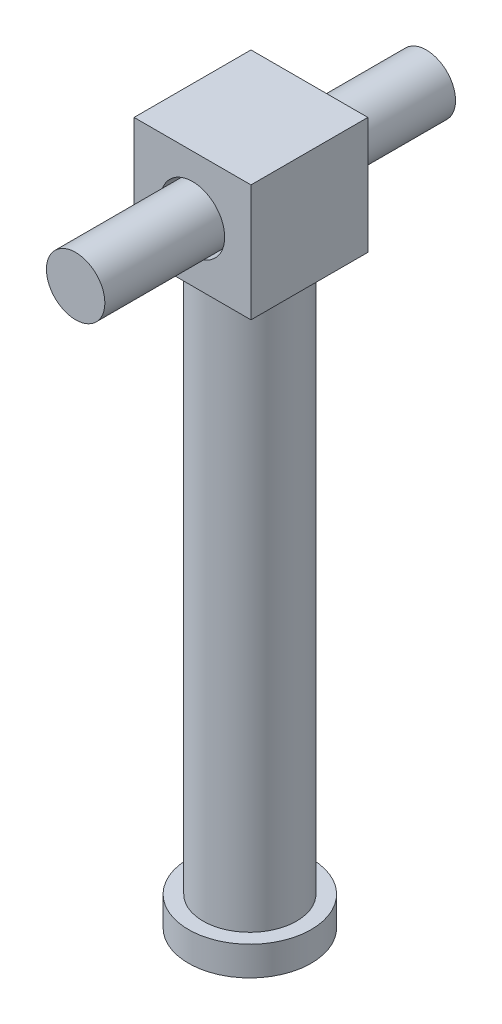
ISO-10303-21;
HEADER;
FILE_DESCRIPTION(('STEP AP214'),'2;1');
FILE_NAME('part.step','',(''),(''),'','','');
FILE_SCHEMA(('AUTOMOTIVE_DESIGN { 1 0 10303 214 1 1 1 1 }'));
ENDSEC;
DATA;
#1=APPLICATION_CONTEXT('core data for automotive mechanical design processes');
#2=APPLICATION_PROTOCOL_DEFINITION('international standard','automotive_design',2000,#1);
#3=PRODUCT_CONTEXT('',#1,'mechanical');
#4=PRODUCT('Part','Part','',(#3));
#5=PRODUCT_RELATED_PRODUCT_CATEGORY('part','',(#4));
#6=PRODUCT_DEFINITION_FORMATION('','',#4);
#7=PRODUCT_DEFINITION_CONTEXT('part definition',#1,'design');
#8=PRODUCT_DEFINITION('design','',#6,#7);
#9=PRODUCT_DEFINITION_SHAPE('','',#8);
#10=(LENGTH_UNIT() NAMED_UNIT(*) SI_UNIT(.MILLI.,.METRE.));
#11=(NAMED_UNIT(*) PLANE_ANGLE_UNIT() SI_UNIT($,.RADIAN.));
#12=(NAMED_UNIT(*) SI_UNIT($,.STERADIAN.) SOLID_ANGLE_UNIT());
#13=UNCERTAINTY_MEASURE_WITH_UNIT(LENGTH_MEASURE(1.E-05),#10,'distance_accuracy_value','');
#14=(GEOMETRIC_REPRESENTATION_CONTEXT(3) GLOBAL_UNCERTAINTY_ASSIGNED_CONTEXT((#13)) GLOBAL_UNIT_ASSIGNED_CONTEXT((#10,
#11,#12)) REPRESENTATION_CONTEXT('',''));
#15=CARTESIAN_POINT('',(0.,0.,0.));
#16=DIRECTION('',(0.,0.,1.));
#17=DIRECTION('',(1.,0.,0.));
#18=AXIS2_PLACEMENT_3D('',#15,#16,#17);
#19=CARTESIAN_POINT('',(0.,100.,0.388679949213961));
#20=DIRECTION('',(0.,-1.,0.));
#21=DIRECTION('',(0.,0.,-1.));
#22=AXIS2_PLACEMENT_3D('',#19,#20,#21);
#23=CYLINDRICAL_SURFACE('',#22,16.);
#24=CARTESIAN_POINT('',(0.,100.,0.388679949213961));
#25=DIRECTION('',(0.,1.,0.));
#26=DIRECTION('',(0.,0.,1.));
#27=AXIS2_PLACEMENT_3D('',#24,#25,#26);
#28=CIRCLE('',#27,16.);
#29=CARTESIAN_POINT('',(0.,100.,-15.611320050786));
#30=VERTEX_POINT('',#29);
#31=EDGE_CURVE('E116',#30,#30,#28,.T.);
#32=CARTESIAN_POINT('',(0.,-90.,0.388679949213961));
#33=DIRECTION('',(0.,-1.,0.));
#34=DIRECTION('',(0.,0.,-1.));
#35=AXIS2_PLACEMENT_3D('',#32,#33,#34);
#36=CIRCLE('',#35,16.);
#37=CARTESIAN_POINT('',(0.,-90.,-15.611320050786));
#38=VERTEX_POINT('',#37);
#39=EDGE_CURVE('E52',#38,#38,#36,.T.);
#40=CARTESIAN_POINT('',(0.,100.,-15.611320050786));
#41=CARTESIAN_POINT('',(0.,98.0208333333333,-15.611320050786));
#42=CARTESIAN_POINT('',(0.,96.0416666666667,-15.611320050786));
#43=CARTESIAN_POINT('',(0.,92.0833333333333,-15.611320050786));
#44=CARTESIAN_POINT('',(0.,90.1041666666667,-15.611320050786));
#45=CARTESIAN_POINT('',(0.,86.1458333333333,-15.611320050786));
#46=CARTESIAN_POINT('',(0.,84.1666666666667,-15.611320050786));
#47=CARTESIAN_POINT('',(0.,80.2083333333333,-15.611320050786));
#48=CARTESIAN_POINT('',(0.,78.2291666666667,-15.611320050786));
#49=CARTESIAN_POINT('',(0.,74.2708333333333,-15.611320050786));
#50=CARTESIAN_POINT('',(0.,72.2916666666667,-15.611320050786));
#51=CARTESIAN_POINT('',(0.,68.3333333333333,-15.611320050786));
#52=CARTESIAN_POINT('',(0.,66.3541666666667,-15.611320050786));
#53=CARTESIAN_POINT('',(0.,62.3958333333333,-15.611320050786));
#54=CARTESIAN_POINT('',(0.,60.4166666666667,-15.611320050786));
#55=CARTESIAN_POINT('',(0.,56.4583333333333,-15.611320050786));
#56=CARTESIAN_POINT('',(0.,54.4791666666667,-15.611320050786));
#57=CARTESIAN_POINT('',(0.,50.5208333333333,-15.611320050786));
#58=CARTESIAN_POINT('',(0.,48.5416666666667,-15.611320050786));
#59=CARTESIAN_POINT('',(0.,44.5833333333333,-15.611320050786));
#60=CARTESIAN_POINT('',(0.,42.6041666666667,-15.611320050786));
#61=CARTESIAN_POINT('',(0.,38.6458333333333,-15.611320050786));
#62=CARTESIAN_POINT('',(0.,36.6666666666667,-15.611320050786));
#63=CARTESIAN_POINT('',(0.,32.7083333333333,-15.611320050786));
#64=CARTESIAN_POINT('',(0.,30.7291666666667,-15.611320050786));
#65=CARTESIAN_POINT('',(0.,26.7708333333333,-15.611320050786));
#66=CARTESIAN_POINT('',(0.,24.7916666666667,-15.611320050786));
#67=CARTESIAN_POINT('',(0.,20.8333333333333,-15.611320050786));
#68=CARTESIAN_POINT('',(0.,18.8541666666667,-15.611320050786));
#69=CARTESIAN_POINT('',(0.,14.8958333333333,-15.611320050786));
#70=CARTESIAN_POINT('',(0.,12.9166666666667,-15.611320050786));
#71=CARTESIAN_POINT('',(0.,8.95833333333332,-15.611320050786));
#72=CARTESIAN_POINT('',(0.,6.97916666666666,-15.611320050786));
#73=CARTESIAN_POINT('',(0.,3.02083333333332,-15.611320050786));
#74=CARTESIAN_POINT('',(0.,1.04166666666666,-15.611320050786));
#75=CARTESIAN_POINT('',(0.,-2.91666666666667,-15.611320050786));
#76=CARTESIAN_POINT('',(0.,-4.89583333333334,-15.611320050786));
#77=CARTESIAN_POINT('',(0.,-8.85416666666667,-15.611320050786));
#78=CARTESIAN_POINT('',(0.,-10.8333333333333,-15.611320050786));
#79=CARTESIAN_POINT('',(0.,-14.7916666666667,-15.611320050786));
#80=CARTESIAN_POINT('',(0.,-16.7708333333333,-15.611320050786));
#81=CARTESIAN_POINT('',(0.,-20.7291666666667,-15.611320050786));
#82=CARTESIAN_POINT('',(0.,-22.7083333333333,-15.611320050786));
#83=CARTESIAN_POINT('',(0.,-26.6666666666667,-15.611320050786));
#84=CARTESIAN_POINT('',(0.,-28.6458333333333,-15.611320050786));
#85=CARTESIAN_POINT('',(0.,-32.6041666666666,-15.611320050786));
#86=CARTESIAN_POINT('',(0.,-34.5833333333333,-15.611320050786));
#87=CARTESIAN_POINT('',(0.,-38.5416666666667,-15.611320050786));
#88=CARTESIAN_POINT('',(0.,-40.5208333333333,-15.611320050786));
#89=CARTESIAN_POINT('',(0.,-44.4791666666667,-15.611320050786));
#90=CARTESIAN_POINT('',(0.,-46.4583333333333,-15.611320050786));
#91=CARTESIAN_POINT('',(0.,-50.4166666666667,-15.611320050786));
#92=CARTESIAN_POINT('',(0.,-52.3958333333333,-15.611320050786));
#93=CARTESIAN_POINT('',(0.,-56.3541666666667,-15.611320050786));
#94=CARTESIAN_POINT('',(0.,-58.3333333333333,-15.611320050786));
#95=CARTESIAN_POINT('',(0.,-62.2916666666667,-15.611320050786));
#96=CARTESIAN_POINT('',(0.,-64.2708333333333,-15.611320050786));
#97=CARTESIAN_POINT('',(0.,-68.2291666666666,-15.611320050786));
#98=CARTESIAN_POINT('',(0.,-70.2083333333333,-15.611320050786));
#99=CARTESIAN_POINT('',(0.,-74.1666666666666,-15.611320050786));
#100=CARTESIAN_POINT('',(0.,-76.1458333333333,-15.611320050786));
#101=CARTESIAN_POINT('',(0.,-80.1041666666666,-15.611320050786));
#102=CARTESIAN_POINT('',(0.,-82.0833333333333,-15.611320050786));
#103=CARTESIAN_POINT('',(0.,-86.0416666666666,-15.611320050786));
#104=CARTESIAN_POINT('',(0.,-88.0208333333333,-15.611320050786));
#105=CARTESIAN_POINT('',(0.,-90.,-15.611320050786));
#106=B_SPLINE_CURVE_WITH_KNOTS('',3,(#40,#41,#42,#43,#44,#45,#46,#47,#48,#49,#50,#51,#52,#53,
#54,#55,#56,#57,#58,#59,#60,#61,#62,#63,#64,#65,#66,#67,#68,#69,#70,#71,#72,#73,#74,#75,#76,#77,
#78,#79,#80,#81,#82,#83,#84,#85,#86,#87,#88,#89,#90,#91,#92,#93,#94,#95,#96,#97,#98,#99,#100,
#101,#102,#103,#104,#105),.UNSPECIFIED.,.F.,.F.,(4,2,2,2,2,2,2,2,2,2,2,2,2,2,2,2,2,2,2,2,2,2,2,
2,2,2,2,2,2,2,2,2,4),(0.,5.9375,11.875,17.8125,23.75,29.6875,35.625,41.5625,47.5,53.4375,59.375,
65.3125,71.25,77.1875,83.125,89.0625,95.,100.9375,106.875,112.8125,118.75,124.6875,130.625,
136.5625,142.5,148.4375,154.375,160.3125,166.25,172.1875,178.125,184.0625,190.),.UNSPECIFIED.);
#107=EDGE_CURVE('BSEAM42',#30,#38,#106,.T.);
#108=ORIENTED_EDGE('',*,*,#31,.F.);
#109=ORIENTED_EDGE('',*,*,#39,.F.);
#110=ORIENTED_EDGE('',*,*,#107,.T.);
#111=ORIENTED_EDGE('',*,*,#107,.F.);
#112=EDGE_LOOP('',(#108,#110,#109,#111));
#113=FACE_BOUND('',#112,.T.);
#114=ADVANCED_FACE('F42',(#113),#23,.T.);
#115=CARTESIAN_POINT('',(20.,140.,20.));
#116=DIRECTION('',(-1.,0.,0.));
#117=DIRECTION('',(0.,0.,1.));
#118=AXIS2_PLACEMENT_3D('',#115,#116,#117);
#119=PLANE('',#118);
#120=DIRECTION('',(0.,0.,-1.));
#121=VECTOR('',#120,1.);
#122=CARTESIAN_POINT('',(20.,100.,20.));
#123=LINE('',#122,#121);
#124=CARTESIAN_POINT('',(20.,100.,20.));
#125=VERTEX_POINT('',#124);
#126=CARTESIAN_POINT('',(20.,100.,-20.));
#127=VERTEX_POINT('',#126);
#128=EDGE_CURVE('E111',#125,#127,#123,.T.);
#129=ORIENTED_EDGE('',*,*,#128,.T.);
#130=DIRECTION('',(0.,-1.,0.));
#131=VECTOR('',#130,1.);
#132=CARTESIAN_POINT('',(20.,140.,-20.));
#133=LINE('',#132,#131);
#134=CARTESIAN_POINT('',(20.,140.,-20.));
#135=VERTEX_POINT('',#134);
#136=EDGE_CURVE('E98',#135,#127,#133,.T.);
#137=ORIENTED_EDGE('',*,*,#136,.F.);
#138=DIRECTION('',(0.,0.,-1.));
#139=VECTOR('',#138,1.);
#140=CARTESIAN_POINT('',(20.,140.,20.));
#141=LINE('',#140,#139);
#142=CARTESIAN_POINT('',(20.,140.,20.));
#143=VERTEX_POINT('',#142);
#144=EDGE_CURVE('E119',#143,#135,#141,.T.);
#145=ORIENTED_EDGE('',*,*,#144,.F.);
#146=DIRECTION('',(0.,-1.,0.));
#147=VECTOR('',#146,1.);
#148=CARTESIAN_POINT('',(20.,140.,20.));
#149=LINE('',#148,#147);
#150=EDGE_CURVE('E113',#143,#125,#149,.T.);
#151=ORIENTED_EDGE('',*,*,#150,.T.);
#152=EDGE_LOOP('',(#129,#137,#145,#151));
#153=FACE_BOUND('',#152,.T.);
#154=ADVANCED_FACE('F151',(#153),#119,.F.);
#155=CARTESIAN_POINT('',(-20.,140.,-20.));
#156=DIRECTION('',(0.,0.,1.));
#157=DIRECTION('',(1.,0.,0.));
#158=AXIS2_PLACEMENT_3D('',#155,#156,#157);
#159=PLANE('',#158);
#160=CARTESIAN_POINT('',(0.,120.,-20.));
#161=DIRECTION('',(0.,0.,1.));
#162=DIRECTION('',(1.,0.,0.));
#163=AXIS2_PLACEMENT_3D('',#160,#161,#162);
#164=CIRCLE('',#163,11.);
#165=CARTESIAN_POINT('',(11.,120.,-20.));
#166=VERTEX_POINT('',#165);
#167=EDGE_CURVE('E46',#166,#166,#164,.T.);
#168=ORIENTED_EDGE('',*,*,#167,.T.);
#169=EDGE_LOOP('',(#168));
#170=FACE_BOUND('',#169,.T.);
#171=DIRECTION('',(-1.,0.,0.));
#172=VECTOR('',#171,1.);
#173=CARTESIAN_POINT('',(-20.,100.,-20.));
#174=LINE('',#173,#172);
#175=CARTESIAN_POINT('',(-20.,100.,-20.));
#176=VERTEX_POINT('',#175);
#177=EDGE_CURVE('E61',#127,#176,#174,.T.);
#178=ORIENTED_EDGE('',*,*,#177,.T.);
#179=DIRECTION('',(0.,-1.,0.));
#180=VECTOR('',#179,1.);
#181=CARTESIAN_POINT('',(-20.,140.,-20.));
#182=LINE('',#181,#180);
#183=CARTESIAN_POINT('',(-20.,140.,-20.));
#184=VERTEX_POINT('',#183);
#185=EDGE_CURVE('E95',#184,#176,#182,.T.);
#186=ORIENTED_EDGE('',*,*,#185,.F.);
#187=DIRECTION('',(-1.,0.,0.));
#188=VECTOR('',#187,1.);
#189=CARTESIAN_POINT('',(-20.,140.,-20.));
#190=LINE('',#189,#188);
#191=EDGE_CURVE('E77',#135,#184,#190,.T.);
#192=ORIENTED_EDGE('',*,*,#191,.F.);
#193=ORIENTED_EDGE('',*,*,#136,.T.);
#194=EDGE_LOOP('',(#178,#186,#192,#193));
#195=FACE_BOUND('',#194,.T.);
#196=ADVANCED_FACE('F94',(#170,#195),#159,.F.);
#197=CARTESIAN_POINT('',(-20.,140.,20.));
#198=DIRECTION('',(1.,0.,0.));
#199=DIRECTION('',(0.,0.,-1.));
#200=AXIS2_PLACEMENT_3D('',#197,#198,#199);
#201=PLANE('',#200);
#202=DIRECTION('',(0.,0.,1.));
#203=VECTOR('',#202,1.);
#204=CARTESIAN_POINT('',(-20.,100.,20.));
#205=LINE('',#204,#203);
#206=CARTESIAN_POINT('',(-20.,100.,20.));
#207=VERTEX_POINT('',#206);
#208=EDGE_CURVE('E92',#176,#207,#205,.T.);
#209=ORIENTED_EDGE('',*,*,#208,.T.);
#210=DIRECTION('',(0.,-1.,0.));
#211=VECTOR('',#210,1.);
#212=CARTESIAN_POINT('',(-20.,140.,20.));
#213=LINE('',#212,#211);
#214=CARTESIAN_POINT('',(-20.,140.,20.));
#215=VERTEX_POINT('',#214);
#216=EDGE_CURVE('E120',#215,#207,#213,.T.);
#217=ORIENTED_EDGE('',*,*,#216,.F.);
#218=DIRECTION('',(0.,0.,1.));
#219=VECTOR('',#218,1.);
#220=CARTESIAN_POINT('',(-20.,140.,20.));
#221=LINE('',#220,#219);
#222=EDGE_CURVE('E102',#184,#215,#221,.T.);
#223=ORIENTED_EDGE('',*,*,#222,.F.);
#224=ORIENTED_EDGE('',*,*,#185,.T.);
#225=EDGE_LOOP('',(#209,#217,#223,#224));
#226=FACE_BOUND('',#225,.T.);
#227=ADVANCED_FACE('F101',(#226),#201,.F.);
#228=CARTESIAN_POINT('',(-20.,140.,20.));
#229=DIRECTION('',(0.,0.,-1.));
#230=DIRECTION('',(-1.,0.,0.));
#231=AXIS2_PLACEMENT_3D('',#228,#229,#230);
#232=PLANE('',#231);
#233=CARTESIAN_POINT('',(0.,120.,20.));
#234=DIRECTION('',(0.,0.,-1.));
#235=DIRECTION('',(-1.,0.,0.));
#236=AXIS2_PLACEMENT_3D('',#233,#234,#235);
#237=CIRCLE('',#236,11.);
#238=CARTESIAN_POINT('',(11.,120.,20.));
#239=VERTEX_POINT('',#238);
#240=EDGE_CURVE('E103',#239,#239,#237,.T.);
#241=ORIENTED_EDGE('',*,*,#240,.T.);
#242=EDGE_LOOP('',(#241));
#243=FACE_BOUND('',#242,.T.);
#244=DIRECTION('',(1.,0.,0.));
#245=VECTOR('',#244,1.);
#246=CARTESIAN_POINT('',(-20.,100.,20.));
#247=LINE('',#246,#245);
#248=EDGE_CURVE('E86',#207,#125,#247,.T.);
#249=ORIENTED_EDGE('',*,*,#248,.T.);
#250=ORIENTED_EDGE('',*,*,#150,.F.);
#251=DIRECTION('',(1.,0.,0.));
#252=VECTOR('',#251,1.);
#253=CARTESIAN_POINT('',(-20.,140.,20.));
#254=LINE('',#253,#252);
#255=EDGE_CURVE('E114',#215,#143,#254,.T.);
#256=ORIENTED_EDGE('',*,*,#255,.F.);
#257=ORIENTED_EDGE('',*,*,#216,.T.);
#258=EDGE_LOOP('',(#249,#250,#256,#257));
#259=FACE_BOUND('',#258,.T.);
#260=ADVANCED_FACE('F164',(#243,#259),#232,.F.);
#261=CARTESIAN_POINT('',(0.,140.,0.));
#262=DIRECTION('',(0.,-1.,0.));
#263=DIRECTION('',(0.,0.,-1.));
#264=AXIS2_PLACEMENT_3D('',#261,#262,#263);
#265=PLANE('',#264);
#266=ORIENTED_EDGE('',*,*,#144,.T.);
#267=ORIENTED_EDGE('',*,*,#191,.T.);
#268=ORIENTED_EDGE('',*,*,#222,.T.);
#269=ORIENTED_EDGE('',*,*,#255,.T.);
#270=EDGE_LOOP('',(#266,#267,#268,#269));
#271=FACE_BOUND('',#270,.T.);
#272=ADVANCED_FACE('F167',(#271),#265,.F.);
#273=CARTESIAN_POINT('',(0.,100.,0.));
#274=DIRECTION('',(0.,-1.,0.));
#275=DIRECTION('',(0.,0.,-1.));
#276=AXIS2_PLACEMENT_3D('',#273,#274,#275);
#277=PLANE('',#276);
#278=ORIENTED_EDGE('',*,*,#31,.T.);
#279=EDGE_LOOP('',(#278));
#280=FACE_BOUND('',#279,.T.);
#281=ORIENTED_EDGE('',*,*,#128,.F.);
#282=ORIENTED_EDGE('',*,*,#248,.F.);
#283=ORIENTED_EDGE('',*,*,#208,.F.);
#284=ORIENTED_EDGE('',*,*,#177,.F.);
#285=EDGE_LOOP('',(#281,#282,#283,#284));
#286=FACE_BOUND('',#285,.T.);
#287=ADVANCED_FACE('F105',(#280,#286),#277,.T.);
#288=CARTESIAN_POINT('',(0.,-90.,0.388679949213951));
#289=DIRECTION('',(0.,-1.,0.));
#290=DIRECTION('',(0.,0.,-1.));
#291=AXIS2_PLACEMENT_3D('',#288,#289,#290);
#292=CYLINDRICAL_SURFACE('',#291,21.);
#293=CARTESIAN_POINT('',(0.,-90.,0.388679949213951));
#294=DIRECTION('',(0.,-1.,0.));
#295=DIRECTION('',(0.,0.,-1.));
#296=AXIS2_PLACEMENT_3D('',#293,#294,#295);
#297=CIRCLE('',#296,21.);
#298=CARTESIAN_POINT('',(0.,-90.,-20.6113200507861));
#299=VERTEX_POINT('',#298);
#300=EDGE_CURVE('E121',#299,#299,#297,.T.);
#301=ORIENTED_EDGE('',*,*,#300,.T.);
#302=EDGE_LOOP('',(#301));
#303=FACE_BOUND('',#302,.T.);
#304=CARTESIAN_POINT('',(0.,-100.,0.388679949213951));
#305=DIRECTION('',(0.,-1.,0.));
#306=DIRECTION('',(0.,0.,-1.));
#307=AXIS2_PLACEMENT_3D('',#304,#305,#306);
#308=CIRCLE('',#307,21.);
#309=CARTESIAN_POINT('',(0.,-100.,-20.6113200507861));
#310=VERTEX_POINT('',#309);
#311=EDGE_CURVE('E12',#310,#310,#308,.T.);
#312=ORIENTED_EDGE('',*,*,#311,.F.);
#313=EDGE_LOOP('',(#312));
#314=FACE_BOUND('',#313,.T.);
#315=ADVANCED_FACE('F171',(#303,#314),#292,.T.);
#316=CARTESIAN_POINT('',(0.,-90.,0.388679949213951));
#317=DIRECTION('',(0.,-1.,0.));
#318=DIRECTION('',(0.,0.,-1.));
#319=AXIS2_PLACEMENT_3D('',#316,#317,#318);
#320=PLANE('',#319);
#321=ORIENTED_EDGE('',*,*,#39,.T.);
#322=EDGE_LOOP('',(#321));
#323=FACE_BOUND('',#322,.T.);
#324=ORIENTED_EDGE('',*,*,#300,.F.);
#325=EDGE_LOOP('',(#324));
#326=FACE_BOUND('',#325,.T.);
#327=ADVANCED_FACE('F146',(#323,#326),#320,.F.);
#328=CARTESIAN_POINT('',(0.,-100.,0.388679949213951));
#329=DIRECTION('',(0.,-1.,0.));
#330=DIRECTION('',(0.,0.,-1.));
#331=AXIS2_PLACEMENT_3D('',#328,#329,#330);
#332=PLANE('',#331);
#333=ORIENTED_EDGE('',*,*,#311,.T.);
#334=EDGE_LOOP('',(#333));
#335=FACE_BOUND('',#334,.T.);
#336=ADVANCED_FACE('F140',(#335),#332,.T.);
#337=CARTESIAN_POINT('',(0.,120.,-40.));
#338=DIRECTION('',(0.,0.,1.));
#339=DIRECTION('',(1.,0.,0.));
#340=AXIS2_PLACEMENT_3D('',#337,#338,#339);
#341=CYLINDRICAL_SURFACE('',#340,11.);
#342=CARTESIAN_POINT('',(11.,120.,20.));
#343=CARTESIAN_POINT('',(11.,120.,19.5833333333333));
#344=CARTESIAN_POINT('',(11.,120.,19.1666666666667));
#345=CARTESIAN_POINT('',(11.,120.,18.3333333333333));
#346=CARTESIAN_POINT('',(11.,120.,17.9166666666667));
#347=CARTESIAN_POINT('',(11.,120.,17.0833333333333));
#348=CARTESIAN_POINT('',(11.,120.,16.6666666666667));
#349=CARTESIAN_POINT('',(11.,120.,15.8333333333333));
#350=CARTESIAN_POINT('',(11.,120.,15.4166666666667));
#351=CARTESIAN_POINT('',(11.,120.,14.5833333333333));
#352=CARTESIAN_POINT('',(11.,120.,14.1666666666667));
#353=CARTESIAN_POINT('',(11.,120.,13.3333333333333));
#354=CARTESIAN_POINT('',(11.,120.,12.9166666666667));
#355=CARTESIAN_POINT('',(11.,120.,12.0833333333333));
#356=CARTESIAN_POINT('',(11.,120.,11.6666666666667));
#357=CARTESIAN_POINT('',(11.,120.,10.8333333333333));
#358=CARTESIAN_POINT('',(11.,120.,10.4166666666667));
#359=CARTESIAN_POINT('',(11.,120.,9.58333333333334));
#360=CARTESIAN_POINT('',(11.,120.,9.16666666666667));
#361=CARTESIAN_POINT('',(11.,120.,8.33333333333334));
#362=CARTESIAN_POINT('',(11.,120.,7.91666666666667));
#363=CARTESIAN_POINT('',(11.,120.,7.08333333333334));
#364=CARTESIAN_POINT('',(11.,120.,6.66666666666667));
#365=CARTESIAN_POINT('',(11.,120.,5.83333333333334));
#366=CARTESIAN_POINT('',(11.,120.,5.41666666666667));
#367=CARTESIAN_POINT('',(11.,120.,4.58333333333334));
#368=CARTESIAN_POINT('',(11.,120.,4.16666666666667));
#369=CARTESIAN_POINT('',(11.,120.,3.33333333333334));
#370=CARTESIAN_POINT('',(11.,120.,2.91666666666667));
#371=CARTESIAN_POINT('',(11.,120.,2.08333333333334));
#372=CARTESIAN_POINT('',(11.,120.,1.66666666666667));
#373=CARTESIAN_POINT('',(11.,120.,0.833333333333341));
#374=CARTESIAN_POINT('',(11.,120.,0.416666666666674));
#375=CARTESIAN_POINT('',(11.,120.,-0.41666666666666));
#376=CARTESIAN_POINT('',(11.,120.,-0.833333333333327));
#377=CARTESIAN_POINT('',(11.,120.,-1.66666666666666));
#378=CARTESIAN_POINT('',(11.,120.,-2.08333333333333));
#379=CARTESIAN_POINT('',(11.,120.,-2.91666666666666));
#380=CARTESIAN_POINT('',(11.,120.,-3.33333333333333));
#381=CARTESIAN_POINT('',(11.,120.,-4.16666666666666));
#382=CARTESIAN_POINT('',(11.,120.,-4.58333333333333));
#383=CARTESIAN_POINT('',(11.,120.,-5.41666666666666));
#384=CARTESIAN_POINT('',(11.,120.,-5.83333333333333));
#385=CARTESIAN_POINT('',(11.,120.,-6.66666666666667));
#386=CARTESIAN_POINT('',(11.,120.,-7.08333333333333));
#387=CARTESIAN_POINT('',(11.,120.,-7.91666666666667));
#388=CARTESIAN_POINT('',(11.,120.,-8.33333333333333));
#389=CARTESIAN_POINT('',(11.,120.,-9.16666666666666));
#390=CARTESIAN_POINT('',(11.,120.,-9.58333333333333));
#391=CARTESIAN_POINT('',(11.,120.,-10.4166666666667));
#392=CARTESIAN_POINT('',(11.,120.,-10.8333333333333));
#393=CARTESIAN_POINT('',(11.,120.,-11.6666666666667));
#394=CARTESIAN_POINT('',(11.,120.,-12.0833333333333));
#395=CARTESIAN_POINT('',(11.,120.,-12.9166666666667));
#396=CARTESIAN_POINT('',(11.,120.,-13.3333333333333));
#397=CARTESIAN_POINT('',(11.,120.,-14.1666666666667));
#398=CARTESIAN_POINT('',(11.,120.,-14.5833333333333));
#399=CARTESIAN_POINT('',(11.,120.,-15.4166666666667));
#400=CARTESIAN_POINT('',(11.,120.,-15.8333333333333));
#401=CARTESIAN_POINT('',(11.,120.,-16.6666666666667));
#402=CARTESIAN_POINT('',(11.,120.,-17.0833333333333));
#403=CARTESIAN_POINT('',(11.,120.,-17.9166666666667));
#404=CARTESIAN_POINT('',(11.,120.,-18.3333333333333));
#405=CARTESIAN_POINT('',(11.,120.,-19.1666666666667));
#406=CARTESIAN_POINT('',(11.,120.,-19.5833333333333));
#407=CARTESIAN_POINT('',(11.,120.,-20.));
#408=B_SPLINE_CURVE_WITH_KNOTS('',3,(#342,#343,#344,#345,#346,#347,#348,#349,#350,#351,#352,
#353,#354,#355,#356,#357,#358,#359,#360,#361,#362,#363,#364,#365,#366,#367,#368,#369,#370,#371,
#372,#373,#374,#375,#376,#377,#378,#379,#380,#381,#382,#383,#384,#385,#386,#387,#388,#389,#390,
#391,#392,#393,#394,#395,#396,#397,#398,#399,#400,#401,#402,#403,#404,#405,#406,#407),
.UNSPECIFIED.,.F.,.F.,(4,2,2,2,2,2,2,2,2,2,2,2,2,2,2,2,2,2,2,2,2,2,2,2,2,2,2,2,2,2,2,2,4),(0.,
1.25,2.5,3.75,5.,6.25000000000001,7.50000000000001,8.75,10.,11.25,12.5,13.75,15.,16.25,17.5,
18.75,20.,21.25,22.5,23.75,25.,26.25,27.5,28.75,30.,31.25,32.5,33.75,35.,36.25,37.5,38.75,40.),.UNSPECIFIED.);
#409=EDGE_CURVE('BSEAM44',#239,#166,#408,.T.);
#410=ORIENTED_EDGE('',*,*,#240,.F.);
#411=ORIENTED_EDGE('',*,*,#167,.F.);
#412=ORIENTED_EDGE('',*,*,#409,.T.);
#413=ORIENTED_EDGE('',*,*,#409,.F.);
#414=EDGE_LOOP('',(#410,#412,#411,#413));
#415=FACE_BOUND('',#414,.T.);
#416=ADVANCED_FACE('F44',(#415),#341,.F.);
#417=CLOSED_SHELL('',(#114,#154,#196,#227,#260,#272,#287,#315,#327,#336,#416));
#418=MANIFOLD_SOLID_BREP('B2',#417);
#419=CARTESIAN_POINT('',(0.,120.,60.));
#420=DIRECTION('',(0.,0.,1.));
#421=DIRECTION('',(1.,0.,0.));
#422=AXIS2_PLACEMENT_3D('',#419,#420,#421);
#423=PLANE('',#422);
#424=CARTESIAN_POINT('',(0.,120.,60.));
#425=DIRECTION('',(0.,0.,1.));
#426=DIRECTION('',(1.,0.,0.));
#427=AXIS2_PLACEMENT_3D('',#424,#425,#426);
#428=CIRCLE('',#427,10.);
#429=CARTESIAN_POINT('',(10.,120.,60.));
#430=VERTEX_POINT('',#429);
#431=EDGE_CURVE('E260',#430,#430,#428,.T.);
#432=ORIENTED_EDGE('',*,*,#431,.T.);
#433=EDGE_LOOP('',(#432));
#434=FACE_BOUND('',#433,.T.);
#435=ADVANCED_FACE('F253',(#434),#423,.T.);
#436=CARTESIAN_POINT('',(0.,120.,-60.));
#437=DIRECTION('',(0.,0.,1.));
#438=DIRECTION('',(1.,0.,0.));
#439=AXIS2_PLACEMENT_3D('',#436,#437,#438);
#440=PLANE('',#439);
#441=CARTESIAN_POINT('',(0.,120.,-60.));
#442=DIRECTION('',(0.,0.,1.));
#443=DIRECTION('',(1.,0.,0.));
#444=AXIS2_PLACEMENT_3D('',#441,#442,#443);
#445=CIRCLE('',#444,10.);
#446=CARTESIAN_POINT('',(10.,120.,-60.));
#447=VERTEX_POINT('',#446);
#448=EDGE_CURVE('E41',#447,#447,#445,.T.);
#449=ORIENTED_EDGE('',*,*,#448,.F.);
#450=EDGE_LOOP('',(#449));
#451=FACE_BOUND('',#450,.T.);
#452=ADVANCED_FACE('F268',(#451),#440,.F.);
#453=CARTESIAN_POINT('',(0.,120.,-60.));
#454=DIRECTION('',(0.,0.,1.));
#455=DIRECTION('',(1.,0.,0.));
#456=AXIS2_PLACEMENT_3D('',#453,#454,#455);
#457=CYLINDRICAL_SURFACE('',#456,10.);
#458=ORIENTED_EDGE('',*,*,#448,.T.);
#459=EDGE_LOOP('',(#458));
#460=FACE_BOUND('',#459,.T.);
#461=ORIENTED_EDGE('',*,*,#431,.F.);
#462=EDGE_LOOP('',(#461));
#463=FACE_BOUND('',#462,.T.);
#464=ADVANCED_FACE('F255',(#460,#463),#457,.T.);
#465=CLOSED_SHELL('',(#435,#452,#464));
#466=MANIFOLD_SOLID_BREP('B6',#465);
#467=ADVANCED_BREP_SHAPE_REPRESENTATION('',(#18,#418,#466),#14);
#468=SHAPE_DEFINITION_REPRESENTATION(#9,#467);
ENDSEC;
END-ISO-10303-21;
